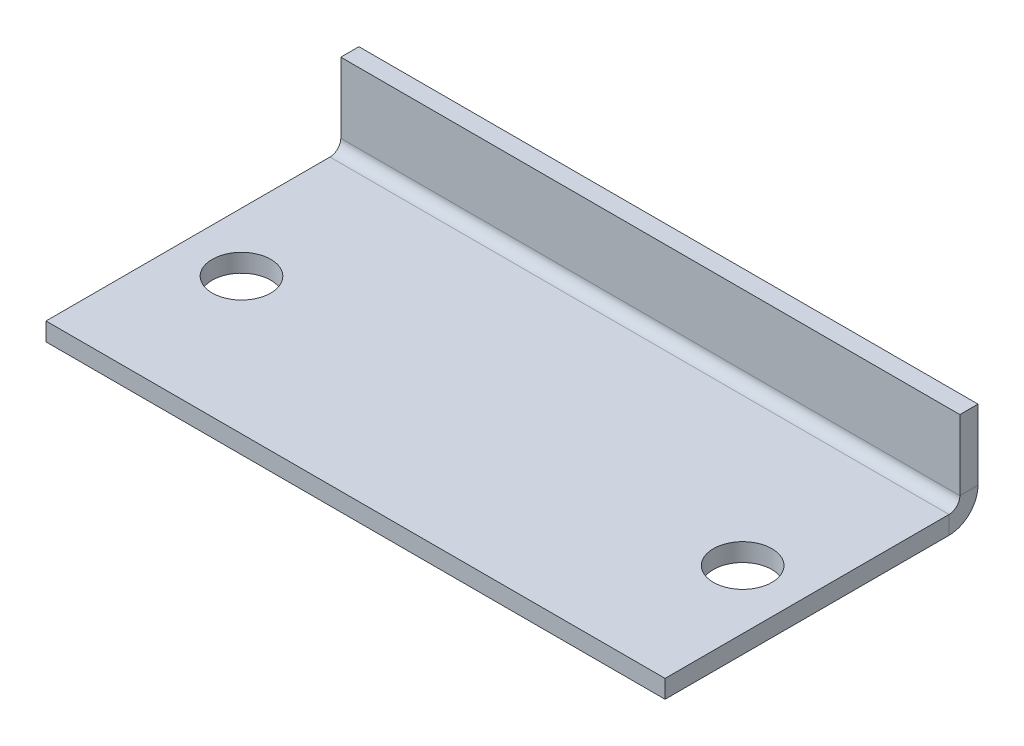
ISO-10303-21;
HEADER;
FILE_DESCRIPTION(('STEP AP214'),'2;1');
FILE_NAME('part.step','',(''),(''),'','','');
FILE_SCHEMA(('AUTOMOTIVE_DESIGN { 1 0 10303 214 1 1 1 1 }'));
ENDSEC;
DATA;
#1=APPLICATION_CONTEXT('core data for automotive mechanical design processes');
#2=APPLICATION_PROTOCOL_DEFINITION('international standard','automotive_design',2000,#1);
#3=PRODUCT_CONTEXT('',#1,'mechanical');
#4=PRODUCT('Part','Part','',(#3));
#5=PRODUCT_RELATED_PRODUCT_CATEGORY('part','',(#4));
#6=PRODUCT_DEFINITION_FORMATION('','',#4);
#7=PRODUCT_DEFINITION_CONTEXT('part definition',#1,'design');
#8=PRODUCT_DEFINITION('design','',#6,#7);
#9=PRODUCT_DEFINITION_SHAPE('','',#8);
#10=(LENGTH_UNIT() NAMED_UNIT(*) SI_UNIT(.MILLI.,.METRE.));
#11=(NAMED_UNIT(*) PLANE_ANGLE_UNIT() SI_UNIT($,.RADIAN.));
#12=(NAMED_UNIT(*) SI_UNIT($,.STERADIAN.) SOLID_ANGLE_UNIT());
#13=UNCERTAINTY_MEASURE_WITH_UNIT(LENGTH_MEASURE(1.E-05),#10,'distance_accuracy_value','');
#14=(GEOMETRIC_REPRESENTATION_CONTEXT(3) GLOBAL_UNCERTAINTY_ASSIGNED_CONTEXT((#13)) GLOBAL_UNIT_ASSIGNED_CONTEXT((#10,
#11,#12)) REPRESENTATION_CONTEXT('',''));
#15=CARTESIAN_POINT('',(0.,0.,0.));
#16=DIRECTION('',(0.,0.,1.));
#17=DIRECTION('',(1.,0.,0.));
#18=AXIS2_PLACEMENT_3D('',#15,#16,#17);
#19=CARTESIAN_POINT('',(-21.,-1.23,20.));
#20=DIRECTION('',(0.,1.,0.));
#21=DIRECTION('',(-1.,0.,0.));
#22=AXIS2_PLACEMENT_3D('',#19,#20,#21);
#23=PLANE('',#22);
#24=DIRECTION('',(-1.,0.,0.));
#25=VECTOR('',#24,1.);
#26=CARTESIAN_POINT('',(-21.,-1.23000000000001,0.736599999999997));
#27=LINE('',#26,#25);
#28=CARTESIAN_POINT('',(-21.,-1.23000000000001,0.736599999999997));
#29=VERTEX_POINT('',#28);
#30=CARTESIAN_POINT('',(21.,-1.22999999999999,0.736599999999997));
#31=VERTEX_POINT('',#30);
#32=EDGE_CURVE('E139',#29,#31,#27,.F.);
#33=ORIENTED_EDGE('',*,*,#32,.T.);
#34=DIRECTION('',(0.,0.,-1.));
#35=VECTOR('',#34,1.);
#36=CARTESIAN_POINT('',(21.,-1.22999999999999,20.));
#37=LINE('',#36,#35);
#38=CARTESIAN_POINT('',(21.,-1.22999999999999,20.));
#39=VERTEX_POINT('',#38);
#40=EDGE_CURVE('E11',#39,#31,#37,.T.);
#41=ORIENTED_EDGE('',*,*,#40,.F.);
#42=DIRECTION('',(1.,0.,0.));
#43=VECTOR('',#42,1.);
#44=CARTESIAN_POINT('',(-21.,-1.23,20.));
#45=LINE('',#44,#43);
#46=CARTESIAN_POINT('',(-21.,-1.23,20.));
#47=VERTEX_POINT('',#46);
#48=EDGE_CURVE('E159',#47,#39,#45,.T.);
#49=ORIENTED_EDGE('',*,*,#48,.F.);
#50=DIRECTION('',(0.,0.,-1.));
#51=VECTOR('',#50,1.);
#52=CARTESIAN_POINT('',(-21.,-1.23,20.));
#53=LINE('',#52,#51);
#54=EDGE_CURVE('E50',#47,#29,#53,.T.);
#55=ORIENTED_EDGE('',*,*,#54,.T.);
#56=EDGE_LOOP('',(#33,#41,#49,#55));
#57=FACE_BOUND('',#56,.T.);
#58=CARTESIAN_POINT('',(-17.,-1.23000000000002,10.7366));
#59=DIRECTION('',(0.,1.,0.));
#60=DIRECTION('',(-1.,0.,0.));
#61=AXIS2_PLACEMENT_3D('',#58,#59,#60);
#62=CIRCLE('',#61,1.984375);
#63=CARTESIAN_POINT('',(-18.984375,-1.23000000000002,10.7366));
#64=VERTEX_POINT('',#63);
#65=EDGE_CURVE('E184',#64,#64,#62,.T.);
#66=ORIENTED_EDGE('',*,*,#65,.T.);
#67=EDGE_LOOP('',(#66));
#68=FACE_BOUND('',#67,.T.);
#69=CARTESIAN_POINT('',(17.,-1.23000000000002,10.7366));
#70=DIRECTION('',(0.,-1.,0.));
#71=DIRECTION('',(1.,0.,0.));
#72=AXIS2_PLACEMENT_3D('',#69,#70,#71);
#73=CIRCLE('',#72,1.984375);
#74=CARTESIAN_POINT('',(18.984375,-1.23000000000002,10.7366));
#75=VERTEX_POINT('',#74);
#76=EDGE_CURVE('E226',#75,#75,#73,.T.);
#77=ORIENTED_EDGE('',*,*,#76,.F.);
#78=EDGE_LOOP('',(#77));
#79=FACE_BOUND('',#78,.T.);
#80=ADVANCED_FACE('F36',(#57,#68,#79),#23,.F.);
#81=CARTESIAN_POINT('',(-21.,0.,20.));
#82=DIRECTION('',(0.,1.,0.));
#83=DIRECTION('',(-1.,0.,0.));
#84=AXIS2_PLACEMENT_3D('',#81,#82,#83);
#85=PLANE('',#84);
#86=DIRECTION('',(0.,0.,-1.));
#87=VECTOR('',#86,1.);
#88=CARTESIAN_POINT('',(21.,0.,20.));
#89=LINE('',#88,#87);
#90=CARTESIAN_POINT('',(21.,0.,20.));
#91=VERTEX_POINT('',#90);
#92=CARTESIAN_POINT('',(21.,0.,0.736599999999997));
#93=VERTEX_POINT('',#92);
#94=EDGE_CURVE('E43',#91,#93,#89,.T.);
#95=ORIENTED_EDGE('',*,*,#94,.T.);
#96=DIRECTION('',(-1.,0.,0.));
#97=VECTOR('',#96,1.);
#98=CARTESIAN_POINT('',(-21.,0.,0.736599999999997));
#99=LINE('',#98,#97);
#100=CARTESIAN_POINT('',(-21.,0.,0.736599999999997));
#101=VERTEX_POINT('',#100);
#102=EDGE_CURVE('E151',#101,#93,#99,.F.);
#103=ORIENTED_EDGE('',*,*,#102,.F.);
#104=DIRECTION('',(0.,0.,-1.));
#105=VECTOR('',#104,1.);
#106=CARTESIAN_POINT('',(-21.,0.,20.));
#107=LINE('',#106,#105);
#108=CARTESIAN_POINT('',(-21.,0.,20.));
#109=VERTEX_POINT('',#108);
#110=EDGE_CURVE('E58',#109,#101,#107,.T.);
#111=ORIENTED_EDGE('',*,*,#110,.F.);
#112=DIRECTION('',(1.,0.,0.));
#113=VECTOR('',#112,1.);
#114=CARTESIAN_POINT('',(-21.,0.,20.));
#115=LINE('',#114,#113);
#116=EDGE_CURVE('E165',#109,#91,#115,.T.);
#117=ORIENTED_EDGE('',*,*,#116,.T.);
#118=EDGE_LOOP('',(#95,#103,#111,#117));
#119=FACE_BOUND('',#118,.T.);
#120=CARTESIAN_POINT('',(-17.,0.,10.7366));
#121=DIRECTION('',(0.,1.,0.));
#122=DIRECTION('',(-1.,0.,0.));
#123=AXIS2_PLACEMENT_3D('',#120,#121,#122);
#124=CIRCLE('',#123,1.984375);
#125=CARTESIAN_POINT('',(-18.984375,0.,10.7366));
#126=VERTEX_POINT('',#125);
#127=EDGE_CURVE('E189',#126,#126,#124,.T.);
#128=ORIENTED_EDGE('',*,*,#127,.F.);
#129=EDGE_LOOP('',(#128));
#130=FACE_BOUND('',#129,.T.);
#131=CARTESIAN_POINT('',(17.,0.,10.7366));
#132=DIRECTION('',(0.,-1.,0.));
#133=DIRECTION('',(1.,0.,0.));
#134=AXIS2_PLACEMENT_3D('',#131,#132,#133);
#135=CIRCLE('',#134,1.984375);
#136=CARTESIAN_POINT('',(18.984375,0.,10.7366));
#137=VERTEX_POINT('',#136);
#138=EDGE_CURVE('E228',#137,#137,#135,.T.);
#139=ORIENTED_EDGE('',*,*,#138,.T.);
#140=EDGE_LOOP('',(#139));
#141=FACE_BOUND('',#140,.T.);
#142=ADVANCED_FACE('F171',(#119,#130,#141),#85,.T.);
#143=CARTESIAN_POINT('',(-21.,-1.23,20.));
#144=DIRECTION('',(-1.,0.,0.));
#145=DIRECTION('',(0.,0.,1.));
#146=AXIS2_PLACEMENT_3D('',#143,#144,#145);
#147=PLANE('',#146);
#148=ORIENTED_EDGE('',*,*,#110,.T.);
#149=DIRECTION('',(0.,-1.,0.));
#150=VECTOR('',#149,1.);
#151=CARTESIAN_POINT('',(-21.,0.,0.736599999999997));
#152=LINE('',#151,#150);
#153=EDGE_CURVE('E145',#101,#29,#152,.T.);
#154=ORIENTED_EDGE('',*,*,#153,.T.);
#155=ORIENTED_EDGE('',*,*,#54,.F.);
#156=DIRECTION('',(0.,1.,0.));
#157=VECTOR('',#156,1.);
#158=CARTESIAN_POINT('',(-21.,-1.23,20.));
#159=LINE('',#158,#157);
#160=EDGE_CURVE('E167',#47,#109,#159,.T.);
#161=ORIENTED_EDGE('',*,*,#160,.T.);
#162=EDGE_LOOP('',(#148,#154,#155,#161));
#163=FACE_BOUND('',#162,.T.);
#164=ADVANCED_FACE('F217',(#163),#147,.T.);
#165=CARTESIAN_POINT('',(21.,0.,20.));
#166=DIRECTION('',(1.,0.,0.));
#167=DIRECTION('',(0.,0.,-1.));
#168=AXIS2_PLACEMENT_3D('',#165,#166,#167);
#169=PLANE('',#168);
#170=DIRECTION('',(0.,-1.,0.));
#171=VECTOR('',#170,1.);
#172=CARTESIAN_POINT('',(21.,0.,0.736599999999997));
#173=LINE('',#172,#171);
#174=EDGE_CURVE('E156',#93,#31,#173,.T.);
#175=ORIENTED_EDGE('',*,*,#174,.F.);
#176=ORIENTED_EDGE('',*,*,#94,.F.);
#177=DIRECTION('',(0.,-1.,0.));
#178=VECTOR('',#177,1.);
#179=CARTESIAN_POINT('',(21.,0.,20.));
#180=LINE('',#179,#178);
#181=EDGE_CURVE('E162',#91,#39,#180,.T.);
#182=ORIENTED_EDGE('',*,*,#181,.T.);
#183=ORIENTED_EDGE('',*,*,#40,.T.);
#184=EDGE_LOOP('',(#175,#176,#182,#183));
#185=FACE_BOUND('',#184,.T.);
#186=ADVANCED_FACE('F332',(#185),#169,.T.);
#187=CARTESIAN_POINT('',(0.,0.,20.));
#188=DIRECTION('',(0.,0.,-1.));
#189=DIRECTION('',(-1.,0.,0.));
#190=AXIS2_PLACEMENT_3D('',#187,#188,#189);
#191=PLANE('',#190);
#192=ORIENTED_EDGE('',*,*,#48,.T.);
#193=ORIENTED_EDGE('',*,*,#181,.F.);
#194=ORIENTED_EDGE('',*,*,#116,.F.);
#195=ORIENTED_EDGE('',*,*,#160,.F.);
#196=EDGE_LOOP('',(#192,#193,#194,#195));
#197=FACE_BOUND('',#196,.T.);
#198=ADVANCED_FACE('F321',(#197),#191,.F.);
#199=CARTESIAN_POINT('',(21.,0.736599999999997,0.736599999999997));
#200=DIRECTION('',(1.,0.,0.));
#201=DIRECTION('',(0.,1.,0.));
#202=AXIS2_PLACEMENT_3D('',#199,#200,#201);
#203=PLANE('',#202);
#204=DIRECTION('',(0.,0.,-1.));
#205=VECTOR('',#204,1.);
#206=CARTESIAN_POINT('',(21.,0.736600000000001,0.));
#207=LINE('',#206,#205);
#208=CARTESIAN_POINT('',(21.,0.736599999999997,0.));
#209=VERTEX_POINT('',#208);
#210=CARTESIAN_POINT('',(21.,0.736599999999997,-1.23));
#211=VERTEX_POINT('',#210);
#212=EDGE_CURVE('E109',#209,#211,#207,.T.);
#213=ORIENTED_EDGE('',*,*,#212,.F.);
#214=CARTESIAN_POINT('',(21.,0.736599999999997,0.736599999999997));
#215=DIRECTION('',(-1.,0.,0.));
#216=DIRECTION('',(0.,-1.,0.));
#217=AXIS2_PLACEMENT_3D('',#214,#215,#216);
#218=CIRCLE('',#217,0.736599999999997);
#219=EDGE_CURVE('E148',#93,#209,#218,.F.);
#220=ORIENTED_EDGE('',*,*,#219,.F.);
#221=ORIENTED_EDGE('',*,*,#174,.T.);
#222=CARTESIAN_POINT('',(21.,0.736599999999997,0.736599999999997));
#223=DIRECTION('',(-1.,0.,0.));
#224=DIRECTION('',(0.,-1.,0.));
#225=AXIS2_PLACEMENT_3D('',#222,#223,#224);
#226=CIRCLE('',#225,1.9666);
#227=EDGE_CURVE('E141',#31,#211,#226,.F.);
#228=ORIENTED_EDGE('',*,*,#227,.T.);
#229=EDGE_LOOP('',(#213,#220,#221,#228));
#230=FACE_BOUND('',#229,.T.);
#231=ADVANCED_FACE('F181',(#230),#203,.T.);
#232=CARTESIAN_POINT('',(-21.,0.736599999999987,0.736599999999997));
#233=DIRECTION('',(1.,0.,0.));
#234=DIRECTION('',(0.,1.,0.));
#235=AXIS2_PLACEMENT_3D('',#232,#233,#234);
#236=PLANE('',#235);
#237=CARTESIAN_POINT('',(-21.,0.736599999999987,0.736599999999997));
#238=DIRECTION('',(-1.,0.,0.));
#239=DIRECTION('',(0.,-1.,0.));
#240=AXIS2_PLACEMENT_3D('',#237,#238,#239);
#241=CIRCLE('',#240,0.736599999999997);
#242=CARTESIAN_POINT('',(-21.,0.736599999999987,0.));
#243=VERTEX_POINT('',#242);
#244=EDGE_CURVE('E137',#243,#101,#241,.T.);
#245=ORIENTED_EDGE('',*,*,#244,.F.);
#246=DIRECTION('',(0.,0.,-1.));
#247=VECTOR('',#246,1.);
#248=CARTESIAN_POINT('',(-21.,0.736599999999993,0.));
#249=LINE('',#248,#247);
#250=CARTESIAN_POINT('',(-21.,0.736600000000006,-1.23));
#251=VERTEX_POINT('',#250);
#252=EDGE_CURVE('E186',#243,#251,#249,.T.);
#253=ORIENTED_EDGE('',*,*,#252,.T.);
#254=CARTESIAN_POINT('',(-21.,0.736599999999987,0.736599999999997));
#255=DIRECTION('',(-1.,0.,0.));
#256=DIRECTION('',(0.,-1.,0.));
#257=AXIS2_PLACEMENT_3D('',#254,#255,#256);
#258=CIRCLE('',#257,1.9666);
#259=EDGE_CURVE('E142',#251,#29,#258,.T.);
#260=ORIENTED_EDGE('',*,*,#259,.T.);
#261=ORIENTED_EDGE('',*,*,#153,.F.);
#262=EDGE_LOOP('',(#245,#253,#260,#261));
#263=FACE_BOUND('',#262,.T.);
#264=ADVANCED_FACE('F195',(#263),#236,.F.);
#265=CARTESIAN_POINT('',(-21.,0.736599999999987,0.736599999999997));
#266=DIRECTION('',(-1.,0.,0.));
#267=DIRECTION('',(0.,0.,-1.));
#268=AXIS2_PLACEMENT_3D('',#265,#266,#267);
#269=CYLINDRICAL_SURFACE('',#268,1.9666);
#270=ORIENTED_EDGE('',*,*,#32,.F.);
#271=ORIENTED_EDGE('',*,*,#259,.F.);
#272=DIRECTION('',(-1.,0.,0.));
#273=VECTOR('',#272,1.);
#274=CARTESIAN_POINT('',(0.,0.736600000000006,-1.23));
#275=LINE('',#274,#273);
#276=EDGE_CURVE('E133',#211,#251,#275,.T.);
#277=ORIENTED_EDGE('',*,*,#276,.F.);
#278=ORIENTED_EDGE('',*,*,#227,.F.);
#279=EDGE_LOOP('',(#270,#271,#277,#278));
#280=FACE_BOUND('',#279,.T.);
#281=ADVANCED_FACE('F292',(#280),#269,.T.);
#282=CARTESIAN_POINT('',(-21.,0.736599999999987,0.736599999999997));
#283=DIRECTION('',(-1.,0.,0.));
#284=DIRECTION('',(0.,0.,-1.));
#285=AXIS2_PLACEMENT_3D('',#282,#283,#284);
#286=CYLINDRICAL_SURFACE('',#285,0.736599999999997);
#287=ORIENTED_EDGE('',*,*,#102,.T.);
#288=ORIENTED_EDGE('',*,*,#219,.T.);
#289=DIRECTION('',(-1.,0.,0.));
#290=VECTOR('',#289,1.);
#291=CARTESIAN_POINT('',(21.,0.736600000000001,0.));
#292=LINE('',#291,#290);
#293=EDGE_CURVE('E183',#209,#243,#292,.T.);
#294=ORIENTED_EDGE('',*,*,#293,.T.);
#295=ORIENTED_EDGE('',*,*,#244,.T.);
#296=EDGE_LOOP('',(#287,#288,#294,#295));
#297=FACE_BOUND('',#296,.T.);
#298=ADVANCED_FACE('F177',(#297),#286,.F.);
#299=CARTESIAN_POINT('',(-21.,0.,-1.23));
#300=DIRECTION('',(-1.,0.,0.));
#301=DIRECTION('',(0.,-1.,0.));
#302=AXIS2_PLACEMENT_3D('',#299,#300,#301);
#303=PLANE('',#302);
#304=DIRECTION('',(0.,-1.,0.));
#305=VECTOR('',#304,1.);
#306=CARTESIAN_POINT('',(-21.,0.,-1.23));
#307=LINE('',#306,#305);
#308=CARTESIAN_POINT('',(-21.,5.5,-1.23));
#309=VERTEX_POINT('',#308);
#310=EDGE_CURVE('E123',#309,#251,#307,.T.);
#311=ORIENTED_EDGE('',*,*,#310,.T.);
#312=ORIENTED_EDGE('',*,*,#252,.F.);
#313=DIRECTION('',(0.,-1.,0.));
#314=VECTOR('',#313,1.);
#315=CARTESIAN_POINT('',(-21.,0.,0.));
#316=LINE('',#315,#314);
#317=CARTESIAN_POINT('',(-21.,5.5,0.));
#318=VERTEX_POINT('',#317);
#319=EDGE_CURVE('E114',#318,#243,#316,.T.);
#320=ORIENTED_EDGE('',*,*,#319,.F.);
#321=DIRECTION('',(0.,0.,1.));
#322=VECTOR('',#321,1.);
#323=CARTESIAN_POINT('',(-21.,5.5,-1.23));
#324=LINE('',#323,#322);
#325=EDGE_CURVE('E122',#309,#318,#324,.T.);
#326=ORIENTED_EDGE('',*,*,#325,.F.);
#327=EDGE_LOOP('',(#311,#312,#320,#326));
#328=FACE_BOUND('',#327,.T.);
#329=ADVANCED_FACE('F199',(#328),#303,.T.);
#330=CARTESIAN_POINT('',(21.,5.5,-1.23));
#331=DIRECTION('',(1.,0.,0.));
#332=DIRECTION('',(0.,1.,0.));
#333=AXIS2_PLACEMENT_3D('',#330,#331,#332);
#334=PLANE('',#333);
#335=DIRECTION('',(0.,1.,0.));
#336=VECTOR('',#335,1.);
#337=CARTESIAN_POINT('',(21.,5.5,0.));
#338=LINE('',#337,#336);
#339=CARTESIAN_POINT('',(21.,5.5,0.));
#340=VERTEX_POINT('',#339);
#341=EDGE_CURVE('E131',#209,#340,#338,.T.);
#342=ORIENTED_EDGE('',*,*,#341,.F.);
#343=ORIENTED_EDGE('',*,*,#212,.T.);
#344=DIRECTION('',(0.,1.,0.));
#345=VECTOR('',#344,1.);
#346=CARTESIAN_POINT('',(21.,5.5,-1.23));
#347=LINE('',#346,#345);
#348=CARTESIAN_POINT('',(21.,5.5,-1.23));
#349=VERTEX_POINT('',#348);
#350=EDGE_CURVE('E103',#211,#349,#347,.T.);
#351=ORIENTED_EDGE('',*,*,#350,.T.);
#352=DIRECTION('',(0.,0.,1.));
#353=VECTOR('',#352,1.);
#354=CARTESIAN_POINT('',(21.,5.5,-1.23));
#355=LINE('',#354,#353);
#356=EDGE_CURVE('E107',#349,#340,#355,.T.);
#357=ORIENTED_EDGE('',*,*,#356,.T.);
#358=EDGE_LOOP('',(#342,#343,#351,#357));
#359=FACE_BOUND('',#358,.T.);
#360=ADVANCED_FACE('F106',(#359),#334,.T.);
#361=CARTESIAN_POINT('',(0.,0.,-1.23));
#362=DIRECTION('',(0.,0.,-1.));
#363=DIRECTION('',(-1.,0.,0.));
#364=AXIS2_PLACEMENT_3D('',#361,#362,#363);
#365=PLANE('',#364);
#366=ORIENTED_EDGE('',*,*,#350,.F.);
#367=ORIENTED_EDGE('',*,*,#276,.T.);
#368=ORIENTED_EDGE('',*,*,#310,.F.);
#369=DIRECTION('',(-1.,0.,0.));
#370=VECTOR('',#369,1.);
#371=CARTESIAN_POINT('',(-21.,5.5,-1.23));
#372=LINE('',#371,#370);
#373=EDGE_CURVE('E113',#349,#309,#372,.T.);
#374=ORIENTED_EDGE('',*,*,#373,.F.);
#375=EDGE_LOOP('',(#366,#367,#368,#374));
#376=FACE_BOUND('',#375,.T.);
#377=ADVANCED_FACE('F125',(#376),#365,.T.);
#378=CARTESIAN_POINT('',(0.,0.,0.));
#379=DIRECTION('',(0.,0.,-1.));
#380=DIRECTION('',(-1.,0.,0.));
#381=AXIS2_PLACEMENT_3D('',#378,#379,#380);
#382=PLANE('',#381);
#383=ORIENTED_EDGE('',*,*,#293,.F.);
#384=ORIENTED_EDGE('',*,*,#341,.T.);
#385=DIRECTION('',(-1.,0.,0.));
#386=VECTOR('',#385,1.);
#387=CARTESIAN_POINT('',(-21.,5.5,0.));
#388=LINE('',#387,#386);
#389=EDGE_CURVE('E121',#340,#318,#388,.T.);
#390=ORIENTED_EDGE('',*,*,#389,.T.);
#391=ORIENTED_EDGE('',*,*,#319,.T.);
#392=EDGE_LOOP('',(#383,#384,#390,#391));
#393=FACE_BOUND('',#392,.T.);
#394=ADVANCED_FACE('F201',(#393),#382,.F.);
#395=CARTESIAN_POINT('',(-21.,5.5,-1.23));
#396=DIRECTION('',(0.,1.,0.));
#397=DIRECTION('',(0.,0.,1.));
#398=AXIS2_PLACEMENT_3D('',#395,#396,#397);
#399=PLANE('',#398);
#400=ORIENTED_EDGE('',*,*,#389,.F.);
#401=ORIENTED_EDGE('',*,*,#356,.F.);
#402=ORIENTED_EDGE('',*,*,#373,.T.);
#403=ORIENTED_EDGE('',*,*,#325,.T.);
#404=EDGE_LOOP('',(#400,#401,#402,#403));
#405=FACE_BOUND('',#404,.T.);
#406=ADVANCED_FACE('F118',(#405),#399,.T.);
#407=CARTESIAN_POINT('',(-17.,-1.23000000000002,10.7366));
#408=DIRECTION('',(0.,1.,0.));
#409=DIRECTION('',(-1.,0.,0.));
#410=AXIS2_PLACEMENT_3D('',#407,#408,#409);
#411=CYLINDRICAL_SURFACE('',#410,1.984375);
#412=ORIENTED_EDGE('',*,*,#65,.F.);
#413=EDGE_LOOP('',(#412));
#414=FACE_BOUND('',#413,.T.);
#415=ORIENTED_EDGE('',*,*,#127,.T.);
#416=EDGE_LOOP('',(#415));
#417=FACE_BOUND('',#416,.T.);
#418=ADVANCED_FACE('F208',(#414,#417),#411,.F.);
#419=CARTESIAN_POINT('',(17.,-1.23000000000002,10.7366));
#420=DIRECTION('',(0.,1.,0.));
#421=DIRECTION('',(-1.,0.,0.));
#422=AXIS2_PLACEMENT_3D('',#419,#420,#421);
#423=CYLINDRICAL_SURFACE('',#422,1.984375);
#424=ORIENTED_EDGE('',*,*,#76,.T.);
#425=EDGE_LOOP('',(#424));
#426=FACE_BOUND('',#425,.T.);
#427=ORIENTED_EDGE('',*,*,#138,.F.);
#428=EDGE_LOOP('',(#427));
#429=FACE_BOUND('',#428,.T.);
#430=ADVANCED_FACE('F237',(#426,#429),#423,.F.);
#431=CLOSED_SHELL('',(#80,#142,#164,#186,#198,#231,#264,#281,#298,#329,#360,#377,#394,#406,#418,#430));
#432=MANIFOLD_SOLID_BREP('B2',#431);
#433=ADVANCED_BREP_SHAPE_REPRESENTATION('',(#18,#432),#14);
#434=SHAPE_DEFINITION_REPRESENTATION(#9,#433);
ENDSEC;
END-ISO-10303-21;
